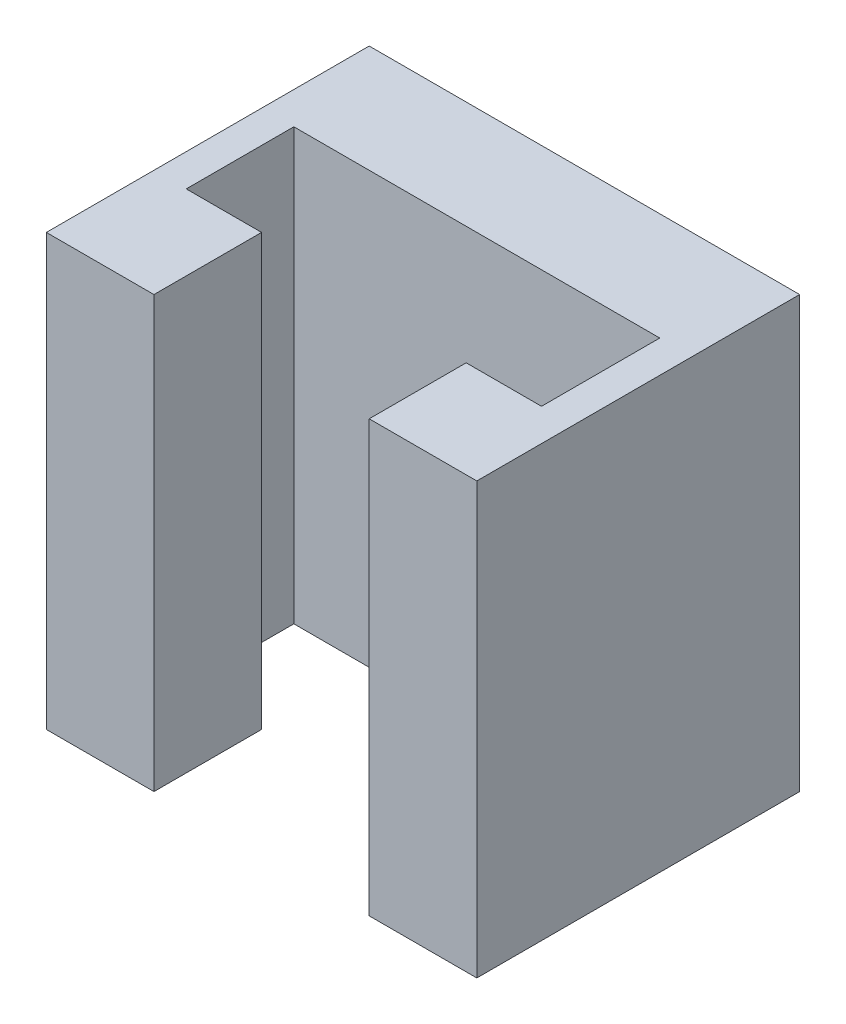
ISO-10303-21;
HEADER;
FILE_DESCRIPTION(('STEP AP214'),'2;1');
FILE_NAME('part.step','',(''),(''),'','','');
FILE_SCHEMA(('AUTOMOTIVE_DESIGN { 1 0 10303 214 1 1 1 1 }'));
ENDSEC;
DATA;
#1=APPLICATION_CONTEXT('core data for automotive mechanical design processes');
#2=APPLICATION_PROTOCOL_DEFINITION('international standard','automotive_design',2000,#1);
#3=PRODUCT_CONTEXT('',#1,'mechanical');
#4=PRODUCT('Part','Part','',(#3));
#5=PRODUCT_RELATED_PRODUCT_CATEGORY('part','',(#4));
#6=PRODUCT_DEFINITION_FORMATION('','',#4);
#7=PRODUCT_DEFINITION_CONTEXT('part definition',#1,'design');
#8=PRODUCT_DEFINITION('design','',#6,#7);
#9=PRODUCT_DEFINITION_SHAPE('','',#8);
#10=(LENGTH_UNIT() NAMED_UNIT(*) SI_UNIT(.MILLI.,.METRE.));
#11=(NAMED_UNIT(*) PLANE_ANGLE_UNIT() SI_UNIT($,.RADIAN.));
#12=(NAMED_UNIT(*) SI_UNIT($,.STERADIAN.) SOLID_ANGLE_UNIT());
#13=UNCERTAINTY_MEASURE_WITH_UNIT(LENGTH_MEASURE(1.E-05),#10,'distance_accuracy_value','');
#14=(GEOMETRIC_REPRESENTATION_CONTEXT(3) GLOBAL_UNCERTAINTY_ASSIGNED_CONTEXT((#13)) GLOBAL_UNIT_ASSIGNED_CONTEXT((#10,
#11,#12)) REPRESENTATION_CONTEXT('',''));
#15=CARTESIAN_POINT('',(0.,0.,0.));
#16=DIRECTION('',(0.,0.,1.));
#17=DIRECTION('',(1.,0.,0.));
#18=AXIS2_PLACEMENT_3D('',#15,#16,#17);
#19=CARTESIAN_POINT('',(0.,20.,-15.));
#20=DIRECTION('',(1.,0.,0.));
#21=DIRECTION('',(0.,0.,-1.));
#22=AXIS2_PLACEMENT_3D('',#19,#20,#21);
#23=PLANE('',#22);
#24=DIRECTION('',(0.,0.,1.));
#25=VECTOR('',#24,1.);
#26=CARTESIAN_POINT('',(0.,0.,-15.));
#27=LINE('',#26,#25);
#28=CARTESIAN_POINT('',(0.,0.,-15.));
#29=VERTEX_POINT('',#28);
#30=CARTESIAN_POINT('',(0.,0.,0.));
#31=VERTEX_POINT('',#30);
#32=EDGE_CURVE('E155',#29,#31,#27,.T.);
#33=ORIENTED_EDGE('',*,*,#32,.T.);
#34=DIRECTION('',(0.,-1.,0.));
#35=VECTOR('',#34,1.);
#36=CARTESIAN_POINT('',(0.,20.,0.));
#37=LINE('',#36,#35);
#38=CARTESIAN_POINT('',(0.,20.,0.));
#39=VERTEX_POINT('',#38);
#40=EDGE_CURVE('E11',#39,#31,#37,.T.);
#41=ORIENTED_EDGE('',*,*,#40,.F.);
#42=DIRECTION('',(0.,0.,1.));
#43=VECTOR('',#42,1.);
#44=CARTESIAN_POINT('',(0.,20.,-15.));
#45=LINE('',#44,#43);
#46=CARTESIAN_POINT('',(0.,20.,-15.));
#47=VERTEX_POINT('',#46);
#48=EDGE_CURVE('E177',#47,#39,#45,.T.);
#49=ORIENTED_EDGE('',*,*,#48,.F.);
#50=DIRECTION('',(0.,-1.,0.));
#51=VECTOR('',#50,1.);
#52=CARTESIAN_POINT('',(0.,20.,-15.));
#53=LINE('',#52,#51);
#54=EDGE_CURVE('E151',#47,#29,#53,.T.);
#55=ORIENTED_EDGE('',*,*,#54,.T.);
#56=EDGE_LOOP('',(#33,#41,#49,#55));
#57=FACE_BOUND('',#56,.T.);
#58=ADVANCED_FACE('F35',(#57),#23,.F.);
#59=CARTESIAN_POINT('',(0.,20.,0.));
#60=DIRECTION('',(0.,0.,-1.));
#61=DIRECTION('',(-1.,0.,0.));
#62=AXIS2_PLACEMENT_3D('',#59,#60,#61);
#63=PLANE('',#62);
#64=DIRECTION('',(1.,0.,0.));
#65=VECTOR('',#64,1.);
#66=CARTESIAN_POINT('',(0.,0.,0.));
#67=LINE('',#66,#65);
#68=CARTESIAN_POINT('',(5.,0.,0.));
#69=VERTEX_POINT('',#68);
#70=EDGE_CURVE('E158',#31,#69,#67,.T.);
#71=ORIENTED_EDGE('',*,*,#70,.T.);
#72=DIRECTION('',(0.,-1.,0.));
#73=VECTOR('',#72,1.);
#74=CARTESIAN_POINT('',(5.,20.,0.));
#75=LINE('',#74,#73);
#76=CARTESIAN_POINT('',(5.,20.,0.));
#77=VERTEX_POINT('',#76);
#78=EDGE_CURVE('E43',#77,#69,#75,.T.);
#79=ORIENTED_EDGE('',*,*,#78,.F.);
#80=DIRECTION('',(1.,0.,0.));
#81=VECTOR('',#80,1.);
#82=CARTESIAN_POINT('',(0.,20.,0.));
#83=LINE('',#82,#81);
#84=EDGE_CURVE('E106',#39,#77,#83,.T.);
#85=ORIENTED_EDGE('',*,*,#84,.F.);
#86=ORIENTED_EDGE('',*,*,#40,.T.);
#87=EDGE_LOOP('',(#71,#79,#85,#86));
#88=FACE_BOUND('',#87,.T.);
#89=ADVANCED_FACE('F255',(#88),#63,.F.);
#90=CARTESIAN_POINT('',(5.,20.,0.));
#91=DIRECTION('',(-1.,0.,0.));
#92=DIRECTION('',(0.,0.,1.));
#93=AXIS2_PLACEMENT_3D('',#90,#91,#92);
#94=PLANE('',#93);
#95=DIRECTION('',(0.,0.,-1.));
#96=VECTOR('',#95,1.);
#97=CARTESIAN_POINT('',(5.,0.,0.));
#98=LINE('',#97,#96);
#99=CARTESIAN_POINT('',(5.,0.,-5.));
#100=VERTEX_POINT('',#99);
#101=EDGE_CURVE('E160',#69,#100,#98,.T.);
#102=ORIENTED_EDGE('',*,*,#101,.T.);
#103=DIRECTION('',(0.,-1.,0.));
#104=VECTOR('',#103,1.);
#105=CARTESIAN_POINT('',(5.,20.,-5.));
#106=LINE('',#105,#104);
#107=CARTESIAN_POINT('',(5.,20.,-5.));
#108=VERTEX_POINT('',#107);
#109=EDGE_CURVE('E196',#108,#100,#106,.T.);
#110=ORIENTED_EDGE('',*,*,#109,.F.);
#111=DIRECTION('',(0.,0.,-1.));
#112=VECTOR('',#111,1.);
#113=CARTESIAN_POINT('',(5.,20.,0.));
#114=LINE('',#113,#112);
#115=EDGE_CURVE('E204',#77,#108,#114,.T.);
#116=ORIENTED_EDGE('',*,*,#115,.F.);
#117=ORIENTED_EDGE('',*,*,#78,.T.);
#118=EDGE_LOOP('',(#102,#110,#116,#117));
#119=FACE_BOUND('',#118,.T.);
#120=ADVANCED_FACE('F202',(#119),#94,.F.);
#121=CARTESIAN_POINT('',(5.,20.,-5.));
#122=DIRECTION('',(0.,0.,1.));
#123=DIRECTION('',(1.,0.,0.));
#124=AXIS2_PLACEMENT_3D('',#121,#122,#123);
#125=PLANE('',#124);
#126=DIRECTION('',(-1.,0.,0.));
#127=VECTOR('',#126,1.);
#128=CARTESIAN_POINT('',(5.,0.,-5.));
#129=LINE('',#128,#127);
#130=CARTESIAN_POINT('',(1.5,0.,-5.));
#131=VERTEX_POINT('',#130);
#132=EDGE_CURVE('E162',#100,#131,#129,.T.);
#133=ORIENTED_EDGE('',*,*,#132,.T.);
#134=DIRECTION('',(0.,-1.,0.));
#135=VECTOR('',#134,1.);
#136=CARTESIAN_POINT('',(1.5,20.,-5.));
#137=LINE('',#136,#135);
#138=CARTESIAN_POINT('',(1.5,20.,-5.));
#139=VERTEX_POINT('',#138);
#140=EDGE_CURVE('E193',#139,#131,#137,.T.);
#141=ORIENTED_EDGE('',*,*,#140,.F.);
#142=DIRECTION('',(-1.,0.,0.));
#143=VECTOR('',#142,1.);
#144=CARTESIAN_POINT('',(5.,20.,-5.));
#145=LINE('',#144,#143);
#146=EDGE_CURVE('E222',#108,#139,#145,.T.);
#147=ORIENTED_EDGE('',*,*,#146,.F.);
#148=ORIENTED_EDGE('',*,*,#109,.T.);
#149=EDGE_LOOP('',(#133,#141,#147,#148));
#150=FACE_BOUND('',#149,.T.);
#151=ADVANCED_FACE('F213',(#150),#125,.F.);
#152=CARTESIAN_POINT('',(1.5,20.,-5.));
#153=DIRECTION('',(-1.,0.,0.));
#154=DIRECTION('',(0.,0.,1.));
#155=AXIS2_PLACEMENT_3D('',#152,#153,#154);
#156=PLANE('',#155);
#157=DIRECTION('',(0.,0.,-1.));
#158=VECTOR('',#157,1.);
#159=CARTESIAN_POINT('',(1.5,0.,-5.));
#160=LINE('',#159,#158);
#161=CARTESIAN_POINT('',(1.5,0.,-10.));
#162=VERTEX_POINT('',#161);
#163=EDGE_CURVE('E164',#131,#162,#160,.T.);
#164=ORIENTED_EDGE('',*,*,#163,.T.);
#165=DIRECTION('',(0.,-1.,0.));
#166=VECTOR('',#165,1.);
#167=CARTESIAN_POINT('',(1.5,20.,-10.));
#168=LINE('',#167,#166);
#169=CARTESIAN_POINT('',(1.5,20.,-10.));
#170=VERTEX_POINT('',#169);
#171=EDGE_CURVE('E190',#170,#162,#168,.T.);
#172=ORIENTED_EDGE('',*,*,#171,.F.);
#173=DIRECTION('',(0.,0.,-1.));
#174=VECTOR('',#173,1.);
#175=CARTESIAN_POINT('',(1.5,20.,-5.));
#176=LINE('',#175,#174);
#177=EDGE_CURVE('E219',#139,#170,#176,.T.);
#178=ORIENTED_EDGE('',*,*,#177,.F.);
#179=ORIENTED_EDGE('',*,*,#140,.T.);
#180=EDGE_LOOP('',(#164,#172,#178,#179));
#181=FACE_BOUND('',#180,.T.);
#182=ADVANCED_FACE('F217',(#181),#156,.F.);
#183=CARTESIAN_POINT('',(1.5,20.,-10.));
#184=DIRECTION('',(0.,0.,-1.));
#185=DIRECTION('',(-1.,0.,0.));
#186=AXIS2_PLACEMENT_3D('',#183,#184,#185);
#187=PLANE('',#186);
#188=DIRECTION('',(1.,0.,0.));
#189=VECTOR('',#188,1.);
#190=CARTESIAN_POINT('',(1.5,0.,-10.));
#191=LINE('',#190,#189);
#192=CARTESIAN_POINT('',(18.5,0.,-10.));
#193=VERTEX_POINT('',#192);
#194=EDGE_CURVE('E166',#162,#193,#191,.T.);
#195=ORIENTED_EDGE('',*,*,#194,.T.);
#196=DIRECTION('',(0.,-1.,0.));
#197=VECTOR('',#196,1.);
#198=CARTESIAN_POINT('',(18.5,20.,-10.));
#199=LINE('',#198,#197);
#200=CARTESIAN_POINT('',(18.5,20.,-10.));
#201=VERTEX_POINT('',#200);
#202=EDGE_CURVE('E187',#201,#193,#199,.T.);
#203=ORIENTED_EDGE('',*,*,#202,.F.);
#204=DIRECTION('',(1.,0.,0.));
#205=VECTOR('',#204,1.);
#206=CARTESIAN_POINT('',(1.5,20.,-10.));
#207=LINE('',#206,#205);
#208=EDGE_CURVE('E221',#170,#201,#207,.T.);
#209=ORIENTED_EDGE('',*,*,#208,.F.);
#210=ORIENTED_EDGE('',*,*,#171,.T.);
#211=EDGE_LOOP('',(#195,#203,#209,#210));
#212=FACE_BOUND('',#211,.T.);
#213=ADVANCED_FACE('F268',(#212),#187,.F.);
#214=CARTESIAN_POINT('',(18.5,20.,-10.));
#215=DIRECTION('',(1.,0.,0.));
#216=DIRECTION('',(0.,0.,-1.));
#217=AXIS2_PLACEMENT_3D('',#214,#215,#216);
#218=PLANE('',#217);
#219=DIRECTION('',(0.,0.,1.));
#220=VECTOR('',#219,1.);
#221=CARTESIAN_POINT('',(18.5,0.,-10.));
#222=LINE('',#221,#220);
#223=CARTESIAN_POINT('',(18.5,0.,-4.50617283950613));
#224=VERTEX_POINT('',#223);
#225=EDGE_CURVE('E168',#193,#224,#222,.T.);
#226=ORIENTED_EDGE('',*,*,#225,.T.);
#227=DIRECTION('',(0.,-1.,0.));
#228=VECTOR('',#227,1.);
#229=CARTESIAN_POINT('',(18.5,20.,-4.50617283950613));
#230=LINE('',#229,#228);
#231=CARTESIAN_POINT('',(18.5,20.,-4.50617283950613));
#232=VERTEX_POINT('',#231);
#233=EDGE_CURVE('E184',#232,#224,#230,.T.);
#234=ORIENTED_EDGE('',*,*,#233,.F.);
#235=DIRECTION('',(0.,0.,1.));
#236=VECTOR('',#235,1.);
#237=CARTESIAN_POINT('',(18.5,20.,-10.));
#238=LINE('',#237,#236);
#239=EDGE_CURVE('E224',#201,#232,#238,.T.);
#240=ORIENTED_EDGE('',*,*,#239,.F.);
#241=ORIENTED_EDGE('',*,*,#202,.T.);
#242=EDGE_LOOP('',(#226,#234,#240,#241));
#243=FACE_BOUND('',#242,.T.);
#244=ADVANCED_FACE('F271',(#243),#218,.F.);
#245=CARTESIAN_POINT('',(18.5,20.,-4.50617283950613));
#246=DIRECTION('',(0.,0.,1.));
#247=DIRECTION('',(1.,0.,0.));
#248=AXIS2_PLACEMENT_3D('',#245,#246,#247);
#249=PLANE('',#248);
#250=DIRECTION('',(-1.,0.,0.));
#251=VECTOR('',#250,1.);
#252=CARTESIAN_POINT('',(18.5,0.,-4.50617283950613));
#253=LINE('',#252,#251);
#254=CARTESIAN_POINT('',(15.,0.,-4.50617283950612));
#255=VERTEX_POINT('',#254);
#256=EDGE_CURVE('E170',#224,#255,#253,.T.);
#257=ORIENTED_EDGE('',*,*,#256,.T.);
#258=DIRECTION('',(0.,-1.,0.));
#259=VECTOR('',#258,1.);
#260=CARTESIAN_POINT('',(15.,20.,-4.50617283950612));
#261=LINE('',#260,#259);
#262=CARTESIAN_POINT('',(15.,20.,-4.50617283950612));
#263=VERTEX_POINT('',#262);
#264=EDGE_CURVE('E181',#263,#255,#261,.T.);
#265=ORIENTED_EDGE('',*,*,#264,.F.);
#266=DIRECTION('',(-1.,0.,0.));
#267=VECTOR('',#266,1.);
#268=CARTESIAN_POINT('',(18.5,20.,-4.50617283950613));
#269=LINE('',#268,#267);
#270=EDGE_CURVE('E230',#232,#263,#269,.T.);
#271=ORIENTED_EDGE('',*,*,#270,.F.);
#272=ORIENTED_EDGE('',*,*,#233,.T.);
#273=EDGE_LOOP('',(#257,#265,#271,#272));
#274=FACE_BOUND('',#273,.T.);
#275=ADVANCED_FACE('F236',(#274),#249,.F.);
#276=CARTESIAN_POINT('',(15.,20.,-4.50617283950612));
#277=DIRECTION('',(1.,0.,0.));
#278=DIRECTION('',(0.,0.,-1.));
#279=AXIS2_PLACEMENT_3D('',#276,#277,#278);
#280=PLANE('',#279);
#281=DIRECTION('',(0.,0.,1.));
#282=VECTOR('',#281,1.);
#283=CARTESIAN_POINT('',(15.,0.,-4.50617283950612));
#284=LINE('',#283,#282);
#285=CARTESIAN_POINT('',(15.,0.,0.));
#286=VERTEX_POINT('',#285);
#287=EDGE_CURVE('E172',#255,#286,#284,.T.);
#288=ORIENTED_EDGE('',*,*,#287,.T.);
#289=DIRECTION('',(0.,-1.,0.));
#290=VECTOR('',#289,1.);
#291=CARTESIAN_POINT('',(15.,20.,0.));
#292=LINE('',#291,#290);
#293=CARTESIAN_POINT('',(15.,20.,0.));
#294=VERTEX_POINT('',#293);
#295=EDGE_CURVE('E146',#294,#286,#292,.T.);
#296=ORIENTED_EDGE('',*,*,#295,.F.);
#297=DIRECTION('',(0.,0.,1.));
#298=VECTOR('',#297,1.);
#299=CARTESIAN_POINT('',(15.,20.,-4.50617283950612));
#300=LINE('',#299,#298);
#301=EDGE_CURVE('E137',#263,#294,#300,.T.);
#302=ORIENTED_EDGE('',*,*,#301,.F.);
#303=ORIENTED_EDGE('',*,*,#264,.T.);
#304=EDGE_LOOP('',(#288,#296,#302,#303));
#305=FACE_BOUND('',#304,.T.);
#306=ADVANCED_FACE('F240',(#305),#280,.F.);
#307=CARTESIAN_POINT('',(15.,20.,0.));
#308=DIRECTION('',(0.,0.,-1.));
#309=DIRECTION('',(-1.,0.,0.));
#310=AXIS2_PLACEMENT_3D('',#307,#308,#309);
#311=PLANE('',#310);
#312=DIRECTION('',(1.,0.,0.));
#313=VECTOR('',#312,1.);
#314=CARTESIAN_POINT('',(15.,0.,0.));
#315=LINE('',#314,#313);
#316=CARTESIAN_POINT('',(20.,0.,0.));
#317=VERTEX_POINT('',#316);
#318=EDGE_CURVE('E145',#286,#317,#315,.T.);
#319=ORIENTED_EDGE('',*,*,#318,.T.);
#320=DIRECTION('',(0.,-1.,0.));
#321=VECTOR('',#320,1.);
#322=CARTESIAN_POINT('',(20.,20.,0.));
#323=LINE('',#322,#321);
#324=CARTESIAN_POINT('',(20.,20.,0.));
#325=VERTEX_POINT('',#324);
#326=EDGE_CURVE('E142',#325,#317,#323,.T.);
#327=ORIENTED_EDGE('',*,*,#326,.F.);
#328=DIRECTION('',(1.,0.,0.));
#329=VECTOR('',#328,1.);
#330=CARTESIAN_POINT('',(15.,20.,0.));
#331=LINE('',#330,#329);
#332=EDGE_CURVE('E131',#294,#325,#331,.T.);
#333=ORIENTED_EDGE('',*,*,#332,.F.);
#334=ORIENTED_EDGE('',*,*,#295,.T.);
#335=EDGE_LOOP('',(#319,#327,#333,#334));
#336=FACE_BOUND('',#335,.T.);
#337=ADVANCED_FACE('F143',(#336),#311,.F.);
#338=CARTESIAN_POINT('',(20.,20.,0.));
#339=DIRECTION('',(-1.,0.,0.));
#340=DIRECTION('',(0.,0.,1.));
#341=AXIS2_PLACEMENT_3D('',#338,#339,#340);
#342=PLANE('',#341);
#343=DIRECTION('',(0.,0.,-1.));
#344=VECTOR('',#343,1.);
#345=CARTESIAN_POINT('',(20.,0.,0.));
#346=LINE('',#345,#344);
#347=CARTESIAN_POINT('',(20.,0.,-15.));
#348=VERTEX_POINT('',#347);
#349=EDGE_CURVE('E92',#317,#348,#346,.T.);
#350=ORIENTED_EDGE('',*,*,#349,.T.);
#351=DIRECTION('',(0.,-1.,0.));
#352=VECTOR('',#351,1.);
#353=CARTESIAN_POINT('',(20.,20.,-15.));
#354=LINE('',#353,#352);
#355=CARTESIAN_POINT('',(20.,20.,-15.));
#356=VERTEX_POINT('',#355);
#357=EDGE_CURVE('E147',#356,#348,#354,.T.);
#358=ORIENTED_EDGE('',*,*,#357,.F.);
#359=DIRECTION('',(0.,0.,-1.));
#360=VECTOR('',#359,1.);
#361=CARTESIAN_POINT('',(20.,20.,0.));
#362=LINE('',#361,#360);
#363=EDGE_CURVE('E135',#325,#356,#362,.T.);
#364=ORIENTED_EDGE('',*,*,#363,.F.);
#365=ORIENTED_EDGE('',*,*,#326,.T.);
#366=EDGE_LOOP('',(#350,#358,#364,#365));
#367=FACE_BOUND('',#366,.T.);
#368=ADVANCED_FACE('F149',(#367),#342,.F.);
#369=CARTESIAN_POINT('',(20.,20.,-15.));
#370=DIRECTION('',(0.,0.,1.));
#371=DIRECTION('',(1.,0.,0.));
#372=AXIS2_PLACEMENT_3D('',#369,#370,#371);
#373=PLANE('',#372);
#374=DIRECTION('',(-1.,0.,0.));
#375=VECTOR('',#374,1.);
#376=CARTESIAN_POINT('',(20.,0.,-15.));
#377=LINE('',#376,#375);
#378=EDGE_CURVE('E98',#348,#29,#377,.T.);
#379=ORIENTED_EDGE('',*,*,#378,.T.);
#380=ORIENTED_EDGE('',*,*,#54,.F.);
#381=DIRECTION('',(-1.,0.,0.));
#382=VECTOR('',#381,1.);
#383=CARTESIAN_POINT('',(20.,20.,-15.));
#384=LINE('',#383,#382);
#385=EDGE_CURVE('E51',#356,#47,#384,.T.);
#386=ORIENTED_EDGE('',*,*,#385,.F.);
#387=ORIENTED_EDGE('',*,*,#357,.T.);
#388=EDGE_LOOP('',(#379,#380,#386,#387));
#389=FACE_BOUND('',#388,.T.);
#390=ADVANCED_FACE('F244',(#389),#373,.F.);
#391=CARTESIAN_POINT('',(0.,20.,0.));
#392=DIRECTION('',(0.,1.,0.));
#393=DIRECTION('',(0.,0.,1.));
#394=AXIS2_PLACEMENT_3D('',#391,#392,#393);
#395=PLANE('',#394);
#396=ORIENTED_EDGE('',*,*,#48,.T.);
#397=ORIENTED_EDGE('',*,*,#84,.T.);
#398=ORIENTED_EDGE('',*,*,#115,.T.);
#399=ORIENTED_EDGE('',*,*,#146,.T.);
#400=ORIENTED_EDGE('',*,*,#177,.T.);
#401=ORIENTED_EDGE('',*,*,#208,.T.);
#402=ORIENTED_EDGE('',*,*,#239,.T.);
#403=ORIENTED_EDGE('',*,*,#270,.T.);
#404=ORIENTED_EDGE('',*,*,#301,.T.);
#405=ORIENTED_EDGE('',*,*,#332,.T.);
#406=ORIENTED_EDGE('',*,*,#363,.T.);
#407=ORIENTED_EDGE('',*,*,#385,.T.);
#408=EDGE_LOOP('',(#396,#397,#398,#399,#400,#401,#402,#403,#404,#405,#406,#407));
#409=FACE_BOUND('',#408,.T.);
#410=ADVANCED_FACE('F133',(#409),#395,.T.);
#411=CARTESIAN_POINT('',(0.,0.,0.));
#412=DIRECTION('',(0.,1.,0.));
#413=DIRECTION('',(0.,0.,1.));
#414=AXIS2_PLACEMENT_3D('',#411,#412,#413);
#415=PLANE('',#414);
#416=ORIENTED_EDGE('',*,*,#32,.F.);
#417=ORIENTED_EDGE('',*,*,#378,.F.);
#418=ORIENTED_EDGE('',*,*,#349,.F.);
#419=ORIENTED_EDGE('',*,*,#318,.F.);
#420=ORIENTED_EDGE('',*,*,#287,.F.);
#421=ORIENTED_EDGE('',*,*,#256,.F.);
#422=ORIENTED_EDGE('',*,*,#225,.F.);
#423=ORIENTED_EDGE('',*,*,#194,.F.);
#424=ORIENTED_EDGE('',*,*,#163,.F.);
#425=ORIENTED_EDGE('',*,*,#132,.F.);
#426=ORIENTED_EDGE('',*,*,#101,.F.);
#427=ORIENTED_EDGE('',*,*,#70,.F.);
#428=EDGE_LOOP('',(#416,#417,#418,#419,#420,#421,#422,#423,#424,#425,#426,#427));
#429=FACE_BOUND('',#428,.T.);
#430=ADVANCED_FACE('F208',(#429),#415,.F.);
#431=CLOSED_SHELL('',(#58,#89,#120,#151,#182,#213,#244,#275,#306,#337,#368,#390,#410,#430));
#432=MANIFOLD_SOLID_BREP('B2',#431);
#433=ADVANCED_BREP_SHAPE_REPRESENTATION('',(#18,#432),#14);
#434=SHAPE_DEFINITION_REPRESENTATION(#9,#433);
ENDSEC;
END-ISO-10303-21;
